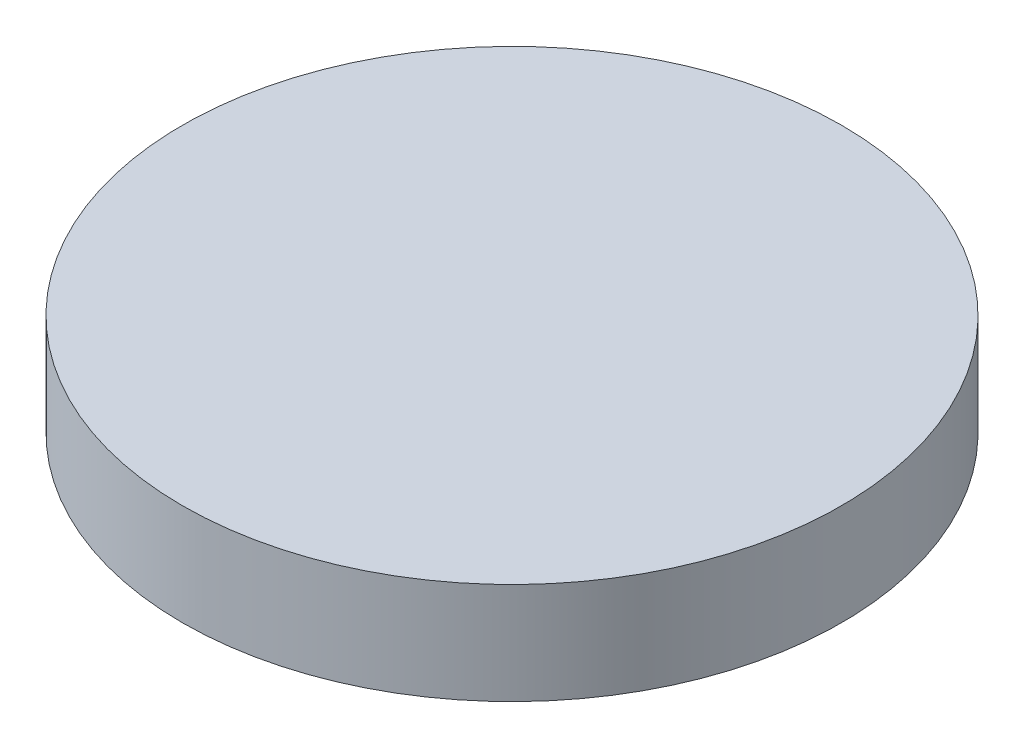
ISO-10303-21;
HEADER;
FILE_DESCRIPTION(('STEP AP214'),'2;1');
FILE_NAME('part.step','',(''),(''),'','','');
FILE_SCHEMA(('AUTOMOTIVE_DESIGN { 1 0 10303 214 1 1 1 1 }'));
ENDSEC;
DATA;
#1=APPLICATION_CONTEXT('core data for automotive mechanical design processes');
#2=APPLICATION_PROTOCOL_DEFINITION('international standard','automotive_design',2000,#1);
#3=PRODUCT_CONTEXT('',#1,'mechanical');
#4=PRODUCT('Part','Part','',(#3));
#5=PRODUCT_RELATED_PRODUCT_CATEGORY('part','',(#4));
#6=PRODUCT_DEFINITION_FORMATION('','',#4);
#7=PRODUCT_DEFINITION_CONTEXT('part definition',#1,'design');
#8=PRODUCT_DEFINITION('design','',#6,#7);
#9=PRODUCT_DEFINITION_SHAPE('','',#8);
#10=(LENGTH_UNIT() NAMED_UNIT(*) SI_UNIT(.MILLI.,.METRE.));
#11=(NAMED_UNIT(*) PLANE_ANGLE_UNIT() SI_UNIT($,.RADIAN.));
#12=(NAMED_UNIT(*) SI_UNIT($,.STERADIAN.) SOLID_ANGLE_UNIT());
#13=UNCERTAINTY_MEASURE_WITH_UNIT(LENGTH_MEASURE(1.E-05),#10,'distance_accuracy_value','');
#14=(GEOMETRIC_REPRESENTATION_CONTEXT(3) GLOBAL_UNCERTAINTY_ASSIGNED_CONTEXT((#13)) GLOBAL_UNIT_ASSIGNED_CONTEXT((#10,
#11,#12)) REPRESENTATION_CONTEXT('',''));
#15=CARTESIAN_POINT('',(0.,0.,0.));
#16=DIRECTION('',(0.,0.,1.));
#17=DIRECTION('',(1.,0.,0.));
#18=AXIS2_PLACEMENT_3D('',#15,#16,#17);
#19=CARTESIAN_POINT('',(0.,10.,0.));
#20=DIRECTION('',(0.,-1.,0.));
#21=DIRECTION('',(0.,0.,-1.));
#22=AXIS2_PLACEMENT_3D('',#19,#20,#21);
#23=CYLINDRICAL_SURFACE('',#22,32.5);
#24=CARTESIAN_POINT('',(0.,10.,0.));
#25=DIRECTION('',(0.,1.,0.));
#26=DIRECTION('',(0.,0.,1.));
#27=AXIS2_PLACEMENT_3D('',#24,#25,#26);
#28=CIRCLE('',#27,32.5);
#29=CARTESIAN_POINT('',(0.,10.,32.5));
#30=VERTEX_POINT('',#29);
#31=EDGE_CURVE('E10',#30,#30,#28,.T.);
#32=ORIENTED_EDGE('',*,*,#31,.F.);
#33=EDGE_LOOP('',(#32));
#34=FACE_BOUND('',#33,.T.);
#35=CARTESIAN_POINT('',(0.,0.,0.));
#36=DIRECTION('',(0.,1.,0.));
#37=DIRECTION('',(0.,0.,1.));
#38=AXIS2_PLACEMENT_3D('',#35,#36,#37);
#39=CIRCLE('',#38,32.5);
#40=CARTESIAN_POINT('',(0.,0.,32.5));
#41=VERTEX_POINT('',#40);
#42=EDGE_CURVE('E40',#41,#41,#39,.T.);
#43=ORIENTED_EDGE('',*,*,#42,.T.);
#44=EDGE_LOOP('',(#43));
#45=FACE_BOUND('',#44,.T.);
#46=ADVANCED_FACE('F37',(#34,#45),#23,.T.);
#47=CARTESIAN_POINT('',(0.,10.,0.));
#48=DIRECTION('',(0.,1.,0.));
#49=DIRECTION('',(0.,0.,1.));
#50=AXIS2_PLACEMENT_3D('',#47,#48,#49);
#51=PLANE('',#50);
#52=ORIENTED_EDGE('',*,*,#31,.T.);
#53=EDGE_LOOP('',(#52));
#54=FACE_BOUND('',#53,.T.);
#55=ADVANCED_FACE('F54',(#54),#51,.T.);
#56=CARTESIAN_POINT('',(0.,0.,0.));
#57=DIRECTION('',(0.,1.,0.));
#58=DIRECTION('',(0.,0.,1.));
#59=AXIS2_PLACEMENT_3D('',#56,#57,#58);
#60=PLANE('',#59);
#61=ORIENTED_EDGE('',*,*,#42,.F.);
#62=EDGE_LOOP('',(#61));
#63=FACE_BOUND('',#62,.T.);
#64=ADVANCED_FACE('F52',(#63),#60,.F.);
#65=CLOSED_SHELL('',(#46,#55,#64));
#66=MANIFOLD_SOLID_BREP('B2',#65);
#67=ADVANCED_BREP_SHAPE_REPRESENTATION('',(#18,#66),#14);
#68=SHAPE_DEFINITION_REPRESENTATION(#9,#67);
ENDSEC;
END-ISO-10303-21;
